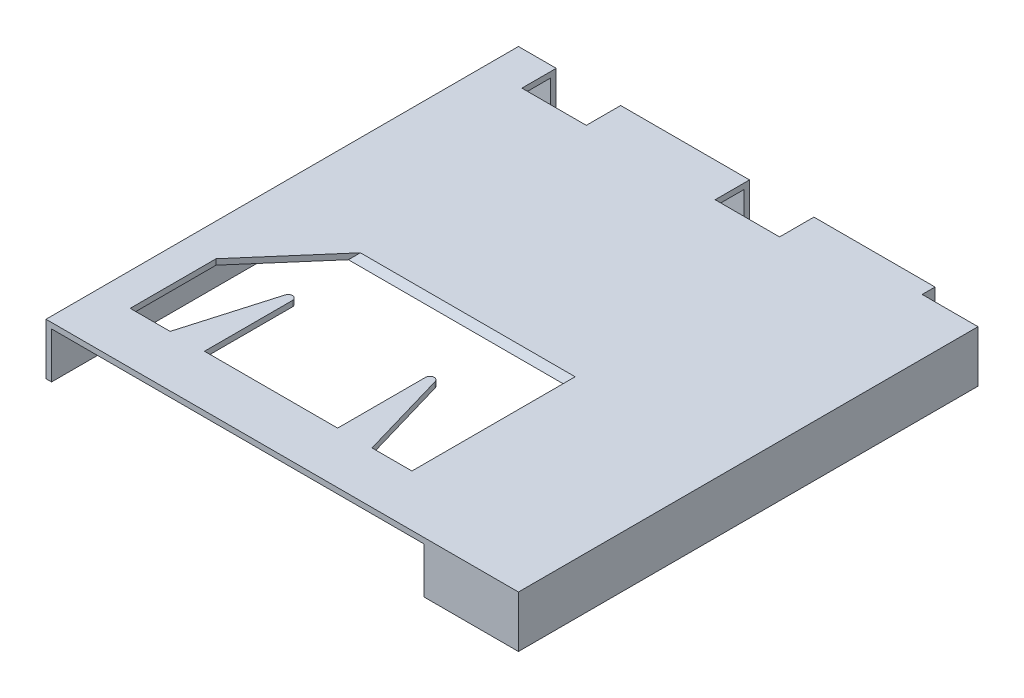
ISO-10303-21;
HEADER;
FILE_DESCRIPTION(('STEP AP214'),'2;1');
FILE_NAME('part.step','',(''),(''),'','','');
FILE_SCHEMA(('AUTOMOTIVE_DESIGN { 1 0 10303 214 1 1 1 1 }'));
ENDSEC;
DATA;
#1=APPLICATION_CONTEXT('core data for automotive mechanical design processes');
#2=APPLICATION_PROTOCOL_DEFINITION('international standard','automotive_design',2000,#1);
#3=PRODUCT_CONTEXT('',#1,'mechanical');
#4=PRODUCT('Part','Part','',(#3));
#5=PRODUCT_RELATED_PRODUCT_CATEGORY('part','',(#4));
#6=PRODUCT_DEFINITION_FORMATION('','',#4);
#7=PRODUCT_DEFINITION_CONTEXT('part definition',#1,'design');
#8=PRODUCT_DEFINITION('design','',#6,#7);
#9=PRODUCT_DEFINITION_SHAPE('','',#8);
#10=(LENGTH_UNIT() NAMED_UNIT(*) SI_UNIT(.MILLI.,.METRE.));
#11=(NAMED_UNIT(*) PLANE_ANGLE_UNIT() SI_UNIT($,.RADIAN.));
#12=(NAMED_UNIT(*) SI_UNIT($,.STERADIAN.) SOLID_ANGLE_UNIT());
#13=UNCERTAINTY_MEASURE_WITH_UNIT(LENGTH_MEASURE(1.E-05),#10,'distance_accuracy_value','');
#14=(GEOMETRIC_REPRESENTATION_CONTEXT(3) GLOBAL_UNCERTAINTY_ASSIGNED_CONTEXT((#13)) GLOBAL_UNIT_ASSIGNED_CONTEXT((#10,
#11,#12)) REPRESENTATION_CONTEXT('',''));
#15=CARTESIAN_POINT('',(0.,0.,0.));
#16=DIRECTION('',(0.,0.,1.));
#17=DIRECTION('',(1.,0.,0.));
#18=AXIS2_PLACEMENT_3D('',#15,#16,#17);
#19=CARTESIAN_POINT('',(-5.8674,1.3589,-5.969));
#20=DIRECTION('',(0.,-1.,0.));
#21=DIRECTION('',(0.,0.,-1.));
#22=AXIS2_PLACEMENT_3D('',#19,#20,#21);
#23=PLANE('',#22);
#24=DIRECTION('',(-1.,0.,0.));
#25=VECTOR('',#24,1.);
#26=CARTESIAN_POINT('',(-5.8674,1.3589,0.82549999999999));
#27=LINE('',#26,#25);
#28=CARTESIAN_POINT('',(2.3114,1.3589,0.82549999999999));
#29=VERTEX_POINT('',#28);
#30=CARTESIAN_POINT('',(-4.20369999999998,1.3589,0.82549999999999));
#31=VERTEX_POINT('',#30);
#32=EDGE_CURVE('E498',#29,#31,#27,.T.);
#33=ORIENTED_EDGE('',*,*,#32,.T.);
#34=DIRECTION('',(0.654930538417845,0.,-0.755689082789815));
#35=VECTOR('',#34,1.);
#36=CARTESIAN_POINT('',(-6.0198,1.3589,2.921));
#37=LINE('',#36,#35);
#38=CARTESIAN_POINT('',(-6.0198,1.3589,2.921));
#39=VERTEX_POINT('',#38);
#40=EDGE_CURVE('E496',#31,#39,#37,.F.);
#41=ORIENTED_EDGE('',*,*,#40,.T.);
#42=DIRECTION('',(0.,0.,-1.));
#43=VECTOR('',#42,1.);
#44=CARTESIAN_POINT('',(-6.0198,1.3589,-5.969));
#45=LINE('',#44,#43);
#46=CARTESIAN_POINT('',(-6.0198,1.3589,5.461));
#47=VERTEX_POINT('',#46);
#48=EDGE_CURVE('E340',#47,#39,#45,.T.);
#49=ORIENTED_EDGE('',*,*,#48,.F.);
#50=DIRECTION('',(-1.,0.,0.));
#51=VECTOR('',#50,1.);
#52=CARTESIAN_POINT('',(-5.8674,1.3589,5.461));
#53=LINE('',#52,#51);
#54=CARTESIAN_POINT('',(-4.8387,1.3589,5.461));
#55=VERTEX_POINT('',#54);
#56=EDGE_CURVE('E343',#55,#47,#53,.T.);
#57=ORIENTED_EDGE('',*,*,#56,.F.);
#58=DIRECTION('',(-0.279451293987715,0.,0.960159869130444));
#59=VECTOR('',#58,1.);
#60=CARTESIAN_POINT('',(-1.85216049436864,1.3589,-4.80037807401234));
#61=LINE('',#60,#59);
#62=CARTESIAN_POINT('',(-4.07164030337957,1.3589,2.825478341064));
#63=VERTEX_POINT('',#62);
#64=EDGE_CURVE('E345',#63,#55,#61,.T.);
#65=ORIENTED_EDGE('',*,*,#64,.F.);
#66=CARTESIAN_POINT('',(-3.9497,1.3589,2.86096865540044));
#67=DIRECTION('',(0.,-1.,0.));
#68=DIRECTION('',(0.,0.,-1.));
#69=AXIS2_PLACEMENT_3D('',#66,#67,#68);
#70=CIRCLE('',#69,0.127);
#71=CARTESIAN_POINT('',(-3.8227,1.3589,2.86096865540044));
#72=VERTEX_POINT('',#71);
#73=EDGE_CURVE('E347',#72,#63,#70,.F.);
#74=ORIENTED_EDGE('',*,*,#73,.F.);
#75=DIRECTION('',(0.,0.,-1.));
#76=VECTOR('',#75,1.);
#77=CARTESIAN_POINT('',(-3.8227,1.3589,-5.969));
#78=LINE('',#77,#76);
#79=CARTESIAN_POINT('',(-3.8227,1.3589,5.461));
#80=VERTEX_POINT('',#79);
#81=EDGE_CURVE('E312',#80,#72,#78,.T.);
#82=ORIENTED_EDGE('',*,*,#81,.F.);
#83=DIRECTION('',(-1.,0.,0.));
#84=VECTOR('',#83,1.);
#85=CARTESIAN_POINT('',(-5.8674,1.3589,5.461));
#86=LINE('',#85,#84);
#87=CARTESIAN_POINT('',(0.114299999999998,1.3589,5.461));
#88=VERTEX_POINT('',#87);
#89=EDGE_CURVE('E269',#88,#80,#86,.T.);
#90=ORIENTED_EDGE('',*,*,#89,.F.);
#91=DIRECTION('',(0.,0.,1.));
#92=VECTOR('',#91,1.);
#93=CARTESIAN_POINT('',(0.114299999999999,1.3589,-5.969));
#94=LINE('',#93,#92);
#95=CARTESIAN_POINT('',(0.114299999999998,1.3589,2.86096865540044));
#96=VERTEX_POINT('',#95);
#97=EDGE_CURVE('E330',#96,#88,#94,.T.);
#98=ORIENTED_EDGE('',*,*,#97,.F.);
#99=CARTESIAN_POINT('',(0.241299999999998,1.3589,2.86096865540044));
#100=DIRECTION('',(0.,-1.,0.));
#101=DIRECTION('',(0.,0.,-1.));
#102=AXIS2_PLACEMENT_3D('',#99,#100,#101);
#103=CIRCLE('',#102,0.127);
#104=CARTESIAN_POINT('',(0.363240303379565,1.3589,2.825478341064));
#105=VERTEX_POINT('',#104);
#106=EDGE_CURVE('E332',#105,#96,#103,.F.);
#107=ORIENTED_EDGE('',*,*,#106,.F.);
#108=DIRECTION('',(-0.279451293987715,0.,-0.960159869130444));
#109=VECTOR('',#108,1.);
#110=CARTESIAN_POINT('',(-2.48304536720141,1.3589,-6.95400500995256));
#111=LINE('',#110,#109);
#112=CARTESIAN_POINT('',(1.1303,1.3589,5.461));
#113=VERTEX_POINT('',#112);
#114=EDGE_CURVE('E334',#113,#105,#111,.T.);
#115=ORIENTED_EDGE('',*,*,#114,.F.);
#116=DIRECTION('',(-1.,0.,0.));
#117=VECTOR('',#116,1.);
#118=CARTESIAN_POINT('',(-5.8674,1.3589,5.461));
#119=LINE('',#118,#117);
#120=CARTESIAN_POINT('',(2.3114,1.3589,5.461));
#121=VERTEX_POINT('',#120);
#122=EDGE_CURVE('E336',#121,#113,#119,.T.);
#123=ORIENTED_EDGE('',*,*,#122,.F.);
#124=DIRECTION('',(0.,0.,1.));
#125=VECTOR('',#124,1.);
#126=CARTESIAN_POINT('',(2.3114,1.3589,-5.969));
#127=LINE('',#126,#125);
#128=EDGE_CURVE('E338',#29,#121,#127,.T.);
#129=ORIENTED_EDGE('',*,*,#128,.F.);
#130=EDGE_LOOP('',(#33,#41,#49,#57,#65,#74,#82,#90,#98,#107,#115,#123,#129));
#131=FACE_BOUND('',#130,.T.);
#132=DIRECTION('',(0.,0.,1.));
#133=VECTOR('',#132,1.);
#134=CARTESIAN_POINT('',(-3.9624,1.3589,-6.985));
#135=LINE('',#134,#133);
#136=CARTESIAN_POINT('',(-3.9624,1.3589,-6.8199));
#137=VERTEX_POINT('',#136);
#138=CARTESIAN_POINT('',(-3.9624,1.3589,-5.969));
#139=VERTEX_POINT('',#138);
#140=EDGE_CURVE('E442',#137,#139,#135,.T.);
#141=ORIENTED_EDGE('',*,*,#140,.F.);
#142=DIRECTION('',(-1.,0.,0.));
#143=VECTOR('',#142,1.);
#144=CARTESIAN_POINT('',(-3.9624,1.3589,-6.8199));
#145=LINE('',#144,#143);
#146=CARTESIAN_POINT('',(-0.152400000000002,1.3589,-6.8199));
#147=VERTEX_POINT('',#146);
#148=EDGE_CURVE('E406',#147,#137,#145,.T.);
#149=ORIENTED_EDGE('',*,*,#148,.F.);
#150=DIRECTION('',(0.,0.,1.));
#151=VECTOR('',#150,1.);
#152=CARTESIAN_POINT('',(-0.152400000000002,1.3589,-6.985));
#153=LINE('',#152,#151);
#154=CARTESIAN_POINT('',(-0.152400000000001,1.3589,-5.969));
#155=VERTEX_POINT('',#154);
#156=EDGE_CURVE('E432',#147,#155,#153,.T.);
#157=ORIENTED_EDGE('',*,*,#156,.T.);
#158=DIRECTION('',(1.,0.,0.));
#159=VECTOR('',#158,1.);
#160=CARTESIAN_POINT('',(-5.8674,1.3589,-5.969));
#161=LINE('',#160,#159);
#162=CARTESIAN_POINT('',(1.7526,1.3589,-5.969));
#163=VERTEX_POINT('',#162);
#164=EDGE_CURVE('E467',#155,#163,#161,.T.);
#165=ORIENTED_EDGE('',*,*,#164,.T.);
#166=DIRECTION('',(0.,0.,-1.));
#167=VECTOR('',#166,1.);
#168=CARTESIAN_POINT('',(1.7526,1.3589,6.985));
#169=LINE('',#168,#167);
#170=CARTESIAN_POINT('',(1.7526,1.3589,-6.8199));
#171=VERTEX_POINT('',#170);
#172=EDGE_CURVE('E371',#163,#171,#169,.T.);
#173=ORIENTED_EDGE('',*,*,#172,.T.);
#174=DIRECTION('',(-1.,0.,0.));
#175=VECTOR('',#174,1.);
#176=CARTESIAN_POINT('',(4.191,1.3589,-6.8199));
#177=LINE('',#176,#175);
#178=CARTESIAN_POINT('',(4.191,1.3589,-6.8199));
#179=VERTEX_POINT('',#178);
#180=EDGE_CURVE('E382',#179,#171,#177,.T.);
#181=ORIENTED_EDGE('',*,*,#180,.F.);
#182=DIRECTION('',(0.,0.,-1.));
#183=VECTOR('',#182,1.);
#184=CARTESIAN_POINT('',(4.191,1.3589,6.985));
#185=LINE('',#184,#183);
#186=CARTESIAN_POINT('',(4.191,1.3589,6.985));
#187=VERTEX_POINT('',#186);
#188=EDGE_CURVE('E376',#187,#179,#185,.T.);
#189=ORIENTED_EDGE('',*,*,#188,.F.);
#190=DIRECTION('',(1.,0.,0.));
#191=VECTOR('',#190,1.);
#192=CARTESIAN_POINT('',(-5.8674,1.3589,6.985));
#193=LINE('',#192,#191);
#194=CARTESIAN_POINT('',(-6.8199,1.3589,6.985));
#195=VERTEX_POINT('',#194);
#196=EDGE_CURVE('E462',#195,#187,#193,.T.);
#197=ORIENTED_EDGE('',*,*,#196,.F.);
#198=DIRECTION('',(0.,0.,1.));
#199=VECTOR('',#198,1.);
#200=CARTESIAN_POINT('',(-6.8199,1.3589,-6.8199));
#201=LINE('',#200,#199);
#202=CARTESIAN_POINT('',(-6.8199,1.3589,-6.8199));
#203=VERTEX_POINT('',#202);
#204=EDGE_CURVE('E391',#203,#195,#201,.T.);
#205=ORIENTED_EDGE('',*,*,#204,.F.);
#206=DIRECTION('',(1.,0.,0.));
#207=VECTOR('',#206,1.);
#208=CARTESIAN_POINT('',(-6.8199,1.3589,-6.8199));
#209=LINE('',#208,#207);
#210=CARTESIAN_POINT('',(-5.8674,1.3589,-6.8199));
#211=VERTEX_POINT('',#210);
#212=EDGE_CURVE('E400',#203,#211,#209,.T.);
#213=ORIENTED_EDGE('',*,*,#212,.T.);
#214=DIRECTION('',(0.,0.,1.));
#215=VECTOR('',#214,1.);
#216=CARTESIAN_POINT('',(-5.8674,1.3589,-6.8199));
#217=LINE('',#216,#215);
#218=CARTESIAN_POINT('',(-5.8674,1.3589,-5.969));
#219=VERTEX_POINT('',#218);
#220=EDGE_CURVE('E392',#211,#219,#217,.T.);
#221=ORIENTED_EDGE('',*,*,#220,.T.);
#222=EDGE_CURVE('E463',#219,#139,#161,.T.);
#223=ORIENTED_EDGE('',*,*,#222,.T.);
#224=EDGE_LOOP('',(#141,#149,#157,#165,#173,#181,#189,#197,#205,#213,#221,#223));
#225=FACE_BOUND('',#224,.T.);
#226=ADVANCED_FACE('F33',(#131,#225),#23,.T.);
#227=CARTESIAN_POINT('',(-5.8674,1.3589,-5.969));
#228=DIRECTION('',(0.,0.,-1.));
#229=DIRECTION('',(-1.,0.,0.));
#230=AXIS2_PLACEMENT_3D('',#227,#228,#229);
#231=PLANE('',#230);
#232=DIRECTION('',(-1.,0.,0.));
#233=VECTOR('',#232,1.);
#234=CARTESIAN_POINT('',(1.7526,1.524,-5.969));
#235=LINE('',#234,#233);
#236=CARTESIAN_POINT('',(-3.9624,1.524,-5.969));
#237=VERTEX_POINT('',#236);
#238=CARTESIAN_POINT('',(-5.8674,1.524,-5.969));
#239=VERTEX_POINT('',#238);
#240=EDGE_CURVE('E476',#237,#239,#235,.T.);
#241=ORIENTED_EDGE('',*,*,#240,.F.);
#242=DIRECTION('',(0.,1.,0.));
#243=VECTOR('',#242,1.);
#244=CARTESIAN_POINT('',(-3.9624,1.524,-5.969));
#245=LINE('',#244,#243);
#246=EDGE_CURVE('E424',#139,#237,#245,.T.);
#247=ORIENTED_EDGE('',*,*,#246,.F.);
#248=ORIENTED_EDGE('',*,*,#222,.F.);
#249=DIRECTION('',(0.,-1.,0.));
#250=VECTOR('',#249,1.);
#251=CARTESIAN_POINT('',(-5.8674,0.,-5.969));
#252=LINE('',#251,#250);
#253=EDGE_CURVE('E444',#239,#219,#252,.T.);
#254=ORIENTED_EDGE('',*,*,#253,.F.);
#255=EDGE_LOOP('',(#241,#247,#248,#254));
#256=FACE_BOUND('',#255,.T.);
#257=ADVANCED_FACE('F556',(#256),#231,.T.);
#258=ORIENTED_EDGE('',*,*,#164,.F.);
#259=DIRECTION('',(0.,-1.,0.));
#260=VECTOR('',#259,1.);
#261=CARTESIAN_POINT('',(-0.152400000000002,1.3589,-5.969));
#262=LINE('',#261,#260);
#263=CARTESIAN_POINT('',(-0.152400000000002,1.524,-5.969));
#264=VERTEX_POINT('',#263);
#265=EDGE_CURVE('E428',#264,#155,#262,.T.);
#266=ORIENTED_EDGE('',*,*,#265,.F.);
#267=CARTESIAN_POINT('',(1.7526,1.524,-5.969));
#268=VERTEX_POINT('',#267);
#269=EDGE_CURVE('E480',#268,#264,#235,.T.);
#270=ORIENTED_EDGE('',*,*,#269,.F.);
#271=DIRECTION('',(0.,1.,0.));
#272=VECTOR('',#271,1.);
#273=CARTESIAN_POINT('',(1.7526,1.3589,-5.969));
#274=LINE('',#273,#272);
#275=EDGE_CURVE('E466',#163,#268,#274,.T.);
#276=ORIENTED_EDGE('',*,*,#275,.F.);
#277=EDGE_LOOP('',(#258,#266,#270,#276));
#278=FACE_BOUND('',#277,.T.);
#279=ADVANCED_FACE('F561',(#278),#231,.T.);
#280=CARTESIAN_POINT('',(6.985,0.,-6.985));
#281=DIRECTION('',(0.,0.,-1.));
#282=DIRECTION('',(-1.,0.,0.));
#283=AXIS2_PLACEMENT_3D('',#280,#281,#282);
#284=PLANE('',#283);
#285=DIRECTION('',(0.,1.,0.));
#286=VECTOR('',#285,1.);
#287=CARTESIAN_POINT('',(5.334,0.,-6.985));
#288=LINE('',#287,#286);
#289=CARTESIAN_POINT('',(5.334,0.,-6.985));
#290=VERTEX_POINT('',#289);
#291=CARTESIAN_POINT('',(5.334,1.524,-6.985));
#292=VERTEX_POINT('',#291);
#293=EDGE_CURVE('E357',#290,#292,#288,.T.);
#294=ORIENTED_EDGE('',*,*,#293,.F.);
#295=DIRECTION('',(-1.,0.,0.));
#296=VECTOR('',#295,1.);
#297=CARTESIAN_POINT('',(6.985,0.,-6.985));
#298=LINE('',#297,#296);
#299=CARTESIAN_POINT('',(1.7526,0.,-6.985));
#300=VERTEX_POINT('',#299);
#301=EDGE_CURVE('E688',#290,#300,#298,.T.);
#302=ORIENTED_EDGE('',*,*,#301,.T.);
#303=DIRECTION('',(0.,1.,0.));
#304=VECTOR('',#303,1.);
#305=CARTESIAN_POINT('',(1.7526,0.,-6.985));
#306=LINE('',#305,#304);
#307=CARTESIAN_POINT('',(1.7526,1.524,-6.985));
#308=VERTEX_POINT('',#307);
#309=EDGE_CURVE('E699',#300,#308,#306,.T.);
#310=ORIENTED_EDGE('',*,*,#309,.T.);
#311=DIRECTION('',(-1.,0.,0.));
#312=VECTOR('',#311,1.);
#313=CARTESIAN_POINT('',(6.985,1.524,-6.985));
#314=LINE('',#313,#312);
#315=EDGE_CURVE('E683',#292,#308,#314,.T.);
#316=ORIENTED_EDGE('',*,*,#315,.F.);
#317=EDGE_LOOP('',(#294,#302,#310,#316));
#318=FACE_BOUND('',#317,.T.);
#319=ADVANCED_FACE('F584',(#318),#284,.T.);
#320=CARTESIAN_POINT('',(6.985,0.,6.985));
#321=DIRECTION('',(1.,0.,0.));
#322=DIRECTION('',(0.,0.,-1.));
#323=AXIS2_PLACEMENT_3D('',#320,#321,#322);
#324=PLANE('',#323);
#325=DIRECTION('',(0.,1.,0.));
#326=VECTOR('',#325,1.);
#327=CARTESIAN_POINT('',(6.985,0.,-6.604));
#328=LINE('',#327,#326);
#329=CARTESIAN_POINT('',(6.985,0.,-6.604));
#330=VERTEX_POINT('',#329);
#331=CARTESIAN_POINT('',(6.985,1.524,-6.604));
#332=VERTEX_POINT('',#331);
#333=EDGE_CURVE('E361',#330,#332,#328,.T.);
#334=ORIENTED_EDGE('',*,*,#333,.T.);
#335=DIRECTION('',(0.,0.,-1.));
#336=VECTOR('',#335,1.);
#337=CARTESIAN_POINT('',(6.985,1.524,6.985));
#338=LINE('',#337,#336);
#339=CARTESIAN_POINT('',(6.985,1.524,6.985));
#340=VERTEX_POINT('',#339);
#341=EDGE_CURVE('E691',#340,#332,#338,.T.);
#342=ORIENTED_EDGE('',*,*,#341,.F.);
#343=DIRECTION('',(0.,1.,0.));
#344=VECTOR('',#343,1.);
#345=CARTESIAN_POINT('',(6.985,0.,6.985));
#346=LINE('',#345,#344);
#347=CARTESIAN_POINT('',(6.985,0.,6.985));
#348=VERTEX_POINT('',#347);
#349=EDGE_CURVE('E494',#348,#340,#346,.T.);
#350=ORIENTED_EDGE('',*,*,#349,.F.);
#351=DIRECTION('',(0.,0.,-1.));
#352=VECTOR('',#351,1.);
#353=CARTESIAN_POINT('',(6.985,0.,6.985));
#354=LINE('',#353,#352);
#355=EDGE_CURVE('E696',#348,#330,#354,.T.);
#356=ORIENTED_EDGE('',*,*,#355,.T.);
#357=EDGE_LOOP('',(#334,#342,#350,#356));
#358=FACE_BOUND('',#357,.T.);
#359=ADVANCED_FACE('F580',(#358),#324,.T.);
#360=CARTESIAN_POINT('',(1.7526,0.,6.985));
#361=DIRECTION('',(0.,0.,1.));
#362=DIRECTION('',(1.,0.,0.));
#363=AXIS2_PLACEMENT_3D('',#360,#361,#362);
#364=PLANE('',#363);
#365=ORIENTED_EDGE('',*,*,#196,.T.);
#366=DIRECTION('',(0.,1.,0.));
#367=VECTOR('',#366,1.);
#368=CARTESIAN_POINT('',(4.191,0.,6.985));
#369=LINE('',#368,#367);
#370=CARTESIAN_POINT('',(4.191,0.,6.985));
#371=VERTEX_POINT('',#370);
#372=EDGE_CURVE('E373',#371,#187,#369,.T.);
#373=ORIENTED_EDGE('',*,*,#372,.F.);
#374=DIRECTION('',(1.,0.,0.));
#375=VECTOR('',#374,1.);
#376=CARTESIAN_POINT('',(1.7526,0.,6.985));
#377=LINE('',#376,#375);
#378=EDGE_CURVE('E694',#371,#348,#377,.T.);
#379=ORIENTED_EDGE('',*,*,#378,.T.);
#380=ORIENTED_EDGE('',*,*,#349,.T.);
#381=DIRECTION('',(1.,0.,0.));
#382=VECTOR('',#381,1.);
#383=CARTESIAN_POINT('',(1.7526,1.524,6.985));
#384=LINE('',#383,#382);
#385=CARTESIAN_POINT('',(-6.985,1.524,6.985));
#386=VERTEX_POINT('',#385);
#387=EDGE_CURVE('E702',#386,#340,#384,.T.);
#388=ORIENTED_EDGE('',*,*,#387,.F.);
#389=DIRECTION('',(0.,-1.,0.));
#390=VECTOR('',#389,1.);
#391=CARTESIAN_POINT('',(-6.985,1.524,6.985));
#392=LINE('',#391,#390);
#393=CARTESIAN_POINT('',(-6.985,0.,6.985));
#394=VERTEX_POINT('',#393);
#395=EDGE_CURVE('E470',#386,#394,#392,.T.);
#396=ORIENTED_EDGE('',*,*,#395,.T.);
#397=DIRECTION('',(1.,0.,0.));
#398=VECTOR('',#397,1.);
#399=CARTESIAN_POINT('',(-6.985,0.,6.985));
#400=LINE('',#399,#398);
#401=CARTESIAN_POINT('',(-6.8199,0.,6.985));
#402=VERTEX_POINT('',#401);
#403=EDGE_CURVE('E678',#394,#402,#400,.T.);
#404=ORIENTED_EDGE('',*,*,#403,.T.);
#405=DIRECTION('',(0.,-1.,0.));
#406=VECTOR('',#405,1.);
#407=CARTESIAN_POINT('',(-6.8199,1.3589,6.985));
#408=LINE('',#407,#406);
#409=EDGE_CURVE('E395',#195,#402,#408,.T.);
#410=ORIENTED_EDGE('',*,*,#409,.F.);
#411=EDGE_LOOP('',(#365,#373,#379,#380,#388,#396,#404,#410));
#412=FACE_BOUND('',#411,.T.);
#413=ADVANCED_FACE('F583',(#412),#364,.T.);
#414=CARTESIAN_POINT('',(1.7526,0.,-6.985));
#415=DIRECTION('',(-1.,0.,0.));
#416=DIRECTION('',(0.,0.,1.));
#417=AXIS2_PLACEMENT_3D('',#414,#415,#416);
#418=PLANE('',#417);
#419=DIRECTION('',(0.,-1.,0.));
#420=VECTOR('',#419,1.);
#421=CARTESIAN_POINT('',(1.7526,1.3589,-6.8199));
#422=LINE('',#421,#420);
#423=CARTESIAN_POINT('',(1.7526,0.,-6.8199));
#424=VERTEX_POINT('',#423);
#425=EDGE_CURVE('E364',#171,#424,#422,.T.);
#426=ORIENTED_EDGE('',*,*,#425,.F.);
#427=ORIENTED_EDGE('',*,*,#172,.F.);
#428=ORIENTED_EDGE('',*,*,#275,.T.);
#429=DIRECTION('',(0.,0.,1.));
#430=VECTOR('',#429,1.);
#431=CARTESIAN_POINT('',(1.7526,1.524,-6.985));
#432=LINE('',#431,#430);
#433=EDGE_CURVE('E477',#308,#268,#432,.T.);
#434=ORIENTED_EDGE('',*,*,#433,.F.);
#435=ORIENTED_EDGE('',*,*,#309,.F.);
#436=DIRECTION('',(0.,0.,1.));
#437=VECTOR('',#436,1.);
#438=CARTESIAN_POINT('',(1.7526,0.,-6.985));
#439=LINE('',#438,#437);
#440=EDGE_CURVE('E690',#300,#424,#439,.T.);
#441=ORIENTED_EDGE('',*,*,#440,.T.);
#442=EDGE_LOOP('',(#426,#427,#428,#434,#435,#441));
#443=FACE_BOUND('',#442,.T.);
#444=ADVANCED_FACE('F576',(#443),#418,.T.);
#445=CARTESIAN_POINT('',(1.7526,0.,-6.985));
#446=DIRECTION('',(0.,1.,0.));
#447=DIRECTION('',(0.,0.,1.));
#448=AXIS2_PLACEMENT_3D('',#445,#446,#447);
#449=PLANE('',#448);
#450=DIRECTION('',(0.,0.,1.));
#451=VECTOR('',#450,1.);
#452=CARTESIAN_POINT('',(5.334,0.,-6.985));
#453=LINE('',#452,#451);
#454=CARTESIAN_POINT('',(5.334,0.,-6.604));
#455=VERTEX_POINT('',#454);
#456=EDGE_CURVE('E350',#290,#455,#453,.T.);
#457=ORIENTED_EDGE('',*,*,#456,.T.);
#458=DIRECTION('',(1.,0.,0.));
#459=VECTOR('',#458,1.);
#460=CARTESIAN_POINT('',(5.334,0.,-6.604));
#461=LINE('',#460,#459);
#462=EDGE_CURVE('E353',#455,#330,#461,.T.);
#463=ORIENTED_EDGE('',*,*,#462,.T.);
#464=ORIENTED_EDGE('',*,*,#355,.F.);
#465=ORIENTED_EDGE('',*,*,#378,.F.);
#466=DIRECTION('',(0.,0.,1.));
#467=VECTOR('',#466,1.);
#468=CARTESIAN_POINT('',(4.191,0.,-6.8199));
#469=LINE('',#468,#467);
#470=CARTESIAN_POINT('',(4.191,0.,-6.8199));
#471=VERTEX_POINT('',#470);
#472=EDGE_CURVE('E370',#471,#371,#469,.T.);
#473=ORIENTED_EDGE('',*,*,#472,.F.);
#474=DIRECTION('',(-1.,0.,0.));
#475=VECTOR('',#474,1.);
#476=CARTESIAN_POINT('',(4.191,0.,-6.8199));
#477=LINE('',#476,#475);
#478=EDGE_CURVE('E379',#471,#424,#477,.T.);
#479=ORIENTED_EDGE('',*,*,#478,.T.);
#480=ORIENTED_EDGE('',*,*,#440,.F.);
#481=ORIENTED_EDGE('',*,*,#301,.F.);
#482=EDGE_LOOP('',(#457,#463,#464,#465,#473,#479,#480,#481));
#483=FACE_BOUND('',#482,.T.);
#484=ADVANCED_FACE('F573',(#483),#449,.F.);
#485=CARTESIAN_POINT('',(1.7526,1.524,-6.985));
#486=DIRECTION('',(0.,1.,0.));
#487=DIRECTION('',(0.,0.,1.));
#488=AXIS2_PLACEMENT_3D('',#485,#486,#487);
#489=PLANE('',#488);
#490=DIRECTION('',(-0.654930538417845,0.,0.755689082789815));
#491=VECTOR('',#490,1.);
#492=CARTESIAN_POINT('',(-6.0198,1.524,2.921));
#493=LINE('',#492,#491);
#494=CARTESIAN_POINT('',(-6.0198,1.524,2.921));
#495=VERTEX_POINT('',#494);
#496=CARTESIAN_POINT('',(-4.03859999999998,1.524,0.63499999999999));
#497=VERTEX_POINT('',#496);
#498=EDGE_CURVE('E48',#495,#497,#493,.F.);
#499=ORIENTED_EDGE('',*,*,#498,.T.);
#500=DIRECTION('',(1.,0.,0.));
#501=VECTOR('',#500,1.);
#502=CARTESIAN_POINT('',(2.3114,1.524,0.63499999999999));
#503=LINE('',#502,#501);
#504=CARTESIAN_POINT('',(2.3114,1.524,0.63499999999999));
#505=VERTEX_POINT('',#504);
#506=EDGE_CURVE('E501',#497,#505,#503,.T.);
#507=ORIENTED_EDGE('',*,*,#506,.T.);
#508=DIRECTION('',(0.,0.,-1.));
#509=VECTOR('',#508,1.);
#510=CARTESIAN_POINT('',(2.3114,1.524,5.461));
#511=LINE('',#510,#509);
#512=CARTESIAN_POINT('',(2.3114,1.524,5.461));
#513=VERTEX_POINT('',#512);
#514=EDGE_CURVE('E55',#513,#505,#511,.T.);
#515=ORIENTED_EDGE('',*,*,#514,.F.);
#516=DIRECTION('',(1.,0.,0.));
#517=VECTOR('',#516,1.);
#518=CARTESIAN_POINT('',(1.1303,1.524,5.461));
#519=LINE('',#518,#517);
#520=CARTESIAN_POINT('',(1.1303,1.524,5.461));
#521=VERTEX_POINT('',#520);
#522=EDGE_CURVE('E298',#521,#513,#519,.T.);
#523=ORIENTED_EDGE('',*,*,#522,.F.);
#524=DIRECTION('',(0.279451293987715,0.,0.960159869130444));
#525=VECTOR('',#524,1.);
#526=CARTESIAN_POINT('',(0.363240303379564,1.524,2.825478341064));
#527=LINE('',#526,#525);
#528=CARTESIAN_POINT('',(0.363240303379565,1.524,2.825478341064));
#529=VERTEX_POINT('',#528);
#530=EDGE_CURVE('E295',#529,#521,#527,.T.);
#531=ORIENTED_EDGE('',*,*,#530,.F.);
#532=CARTESIAN_POINT('',(0.241299999999998,1.524,2.86096865540044));
#533=DIRECTION('',(0.,-1.,0.));
#534=DIRECTION('',(0.,0.,-1.));
#535=AXIS2_PLACEMENT_3D('',#532,#533,#534);
#536=CIRCLE('',#535,0.127);
#537=CARTESIAN_POINT('',(0.114299999999998,1.524,2.86096865540044));
#538=VERTEX_POINT('',#537);
#539=EDGE_CURVE('E289',#538,#529,#536,.T.);
#540=ORIENTED_EDGE('',*,*,#539,.F.);
#541=DIRECTION('',(0.,0.,-1.));
#542=VECTOR('',#541,1.);
#543=CARTESIAN_POINT('',(0.114299999999998,1.524,5.461));
#544=LINE('',#543,#542);
#545=CARTESIAN_POINT('',(0.114299999999998,1.524,5.461));
#546=VERTEX_POINT('',#545);
#547=EDGE_CURVE('E287',#546,#538,#544,.T.);
#548=ORIENTED_EDGE('',*,*,#547,.F.);
#549=DIRECTION('',(1.,0.,0.));
#550=VECTOR('',#549,1.);
#551=CARTESIAN_POINT('',(-3.8227,1.524,5.461));
#552=LINE('',#551,#550);
#553=CARTESIAN_POINT('',(-3.8227,1.524,5.461));
#554=VERTEX_POINT('',#553);
#555=EDGE_CURVE('E266',#554,#546,#552,.T.);
#556=ORIENTED_EDGE('',*,*,#555,.F.);
#557=DIRECTION('',(0.,0.,1.));
#558=VECTOR('',#557,1.);
#559=CARTESIAN_POINT('',(-3.8227,1.524,2.86096865540044));
#560=LINE('',#559,#558);
#561=CARTESIAN_POINT('',(-3.8227,1.524,2.86096865540044));
#562=VERTEX_POINT('',#561);
#563=EDGE_CURVE('E277',#562,#554,#560,.T.);
#564=ORIENTED_EDGE('',*,*,#563,.F.);
#565=CARTESIAN_POINT('',(-3.9497,1.524,2.86096865540044));
#566=DIRECTION('',(0.,-1.,0.));
#567=DIRECTION('',(0.,0.,-1.));
#568=AXIS2_PLACEMENT_3D('',#565,#566,#567);
#569=CIRCLE('',#568,0.127);
#570=CARTESIAN_POINT('',(-4.07164030337957,1.524,2.825478341064));
#571=VERTEX_POINT('',#570);
#572=EDGE_CURVE('E281',#571,#562,#569,.T.);
#573=ORIENTED_EDGE('',*,*,#572,.F.);
#574=DIRECTION('',(0.279451293987715,0.,-0.960159869130444));
#575=VECTOR('',#574,1.);
#576=CARTESIAN_POINT('',(-4.8387,1.524,5.461));
#577=LINE('',#576,#575);
#578=CARTESIAN_POINT('',(-4.8387,1.524,5.461));
#579=VERTEX_POINT('',#578);
#580=EDGE_CURVE('E307',#579,#571,#577,.T.);
#581=ORIENTED_EDGE('',*,*,#580,.F.);
#582=DIRECTION('',(1.,0.,0.));
#583=VECTOR('',#582,1.);
#584=CARTESIAN_POINT('',(-6.0198,1.524,5.461));
#585=LINE('',#584,#583);
#586=CARTESIAN_POINT('',(-6.0198,1.524,5.461));
#587=VERTEX_POINT('',#586);
#588=EDGE_CURVE('E304',#587,#579,#585,.T.);
#589=ORIENTED_EDGE('',*,*,#588,.F.);
#590=DIRECTION('',(0.,0.,1.));
#591=VECTOR('',#590,1.);
#592=CARTESIAN_POINT('',(-6.0198,1.524,1.778));
#593=LINE('',#592,#591);
#594=EDGE_CURVE('E302',#495,#587,#593,.T.);
#595=ORIENTED_EDGE('',*,*,#594,.F.);
#596=EDGE_LOOP('',(#499,#507,#515,#523,#531,#540,#548,#556,#564,#573,#581,#589,#595));
#597=FACE_BOUND('',#596,.T.);
#598=DIRECTION('',(1.,0.,0.));
#599=VECTOR('',#598,1.);
#600=CARTESIAN_POINT('',(5.334,1.524,-6.604));
#601=LINE('',#600,#599);
#602=CARTESIAN_POINT('',(5.334,1.524,-6.604));
#603=VERTEX_POINT('',#602);
#604=EDGE_CURVE('E354',#603,#332,#601,.T.);
#605=ORIENTED_EDGE('',*,*,#604,.F.);
#606=DIRECTION('',(0.,0.,1.));
#607=VECTOR('',#606,1.);
#608=CARTESIAN_POINT('',(5.334,1.524,-6.985));
#609=LINE('',#608,#607);
#610=EDGE_CURVE('E349',#292,#603,#609,.T.);
#611=ORIENTED_EDGE('',*,*,#610,.F.);
#612=ORIENTED_EDGE('',*,*,#315,.T.);
#613=ORIENTED_EDGE('',*,*,#433,.T.);
#614=ORIENTED_EDGE('',*,*,#269,.T.);
#615=DIRECTION('',(0.,0.,1.));
#616=VECTOR('',#615,1.);
#617=CARTESIAN_POINT('',(-0.152400000000002,1.524,-6.985));
#618=LINE('',#617,#616);
#619=CARTESIAN_POINT('',(-0.152400000000002,1.524,-6.985));
#620=VERTEX_POINT('',#619);
#621=EDGE_CURVE('E437',#620,#264,#618,.T.);
#622=ORIENTED_EDGE('',*,*,#621,.F.);
#623=DIRECTION('',(1.,0.,0.));
#624=VECTOR('',#623,1.);
#625=CARTESIAN_POINT('',(-0.152400000000002,1.524,-6.985));
#626=LINE('',#625,#624);
#627=CARTESIAN_POINT('',(-3.9624,1.524,-6.985));
#628=VERTEX_POINT('',#627);
#629=EDGE_CURVE('E427',#628,#620,#626,.T.);
#630=ORIENTED_EDGE('',*,*,#629,.F.);
#631=DIRECTION('',(0.,0.,1.));
#632=VECTOR('',#631,1.);
#633=CARTESIAN_POINT('',(-3.9624,1.524,-6.985));
#634=LINE('',#633,#632);
#635=EDGE_CURVE('E439',#628,#237,#634,.T.);
#636=ORIENTED_EDGE('',*,*,#635,.T.);
#637=ORIENTED_EDGE('',*,*,#240,.T.);
#638=DIRECTION('',(0.,0.,1.));
#639=VECTOR('',#638,1.);
#640=CARTESIAN_POINT('',(-5.8674,1.524,-6.985));
#641=LINE('',#640,#639);
#642=CARTESIAN_POINT('',(-5.8674,1.524,-6.985));
#643=VERTEX_POINT('',#642);
#644=EDGE_CURVE('E457',#643,#239,#641,.T.);
#645=ORIENTED_EDGE('',*,*,#644,.F.);
#646=DIRECTION('',(1.,0.,0.));
#647=VECTOR('',#646,1.);
#648=CARTESIAN_POINT('',(-5.8674,1.524,-6.985));
#649=LINE('',#648,#647);
#650=CARTESIAN_POINT('',(-6.985,1.524,-6.985));
#651=VERTEX_POINT('',#650);
#652=EDGE_CURVE('E445',#651,#643,#649,.T.);
#653=ORIENTED_EDGE('',*,*,#652,.F.);
#654=DIRECTION('',(0.,0.,1.));
#655=VECTOR('',#654,1.);
#656=CARTESIAN_POINT('',(-6.985,1.524,-5.969));
#657=LINE('',#656,#655);
#658=EDGE_CURVE('E483',#651,#386,#657,.T.);
#659=ORIENTED_EDGE('',*,*,#658,.T.);
#660=ORIENTED_EDGE('',*,*,#387,.T.);
#661=ORIENTED_EDGE('',*,*,#341,.T.);
#662=EDGE_LOOP('',(#605,#611,#612,#613,#614,#622,#630,#636,#637,#645,#653,#659,#660,#661));
#663=FACE_BOUND('',#662,.T.);
#664=ADVANCED_FACE('F283',(#597,#663),#489,.T.);
#665=CARTESIAN_POINT('',(-5.8674,0.,-5.969));
#666=DIRECTION('',(1.,0.,0.));
#667=DIRECTION('',(0.,1.,0.));
#668=AXIS2_PLACEMENT_3D('',#665,#666,#667);
#669=PLANE('',#668);
#670=DIRECTION('',(0.,1.,0.));
#671=VECTOR('',#670,1.);
#672=CARTESIAN_POINT('',(-5.8674,0.,-6.8199));
#673=LINE('',#672,#671);
#674=CARTESIAN_POINT('',(-5.8674,0.,-6.8199));
#675=VERTEX_POINT('',#674);
#676=EDGE_CURVE('E385',#675,#211,#673,.T.);
#677=ORIENTED_EDGE('',*,*,#676,.F.);
#678=DIRECTION('',(0.,0.,1.));
#679=VECTOR('',#678,1.);
#680=CARTESIAN_POINT('',(-5.8674,0.,-5.969));
#681=LINE('',#680,#679);
#682=CARTESIAN_POINT('',(-5.8674,0.,-6.985));
#683=VERTEX_POINT('',#682);
#684=EDGE_CURVE('E667',#683,#675,#681,.T.);
#685=ORIENTED_EDGE('',*,*,#684,.F.);
#686=DIRECTION('',(0.,-1.,0.));
#687=VECTOR('',#686,1.);
#688=CARTESIAN_POINT('',(-5.8674,0.,-6.985));
#689=LINE('',#688,#687);
#690=EDGE_CURVE('E448',#643,#683,#689,.T.);
#691=ORIENTED_EDGE('',*,*,#690,.F.);
#692=ORIENTED_EDGE('',*,*,#644,.T.);
#693=ORIENTED_EDGE('',*,*,#253,.T.);
#694=ORIENTED_EDGE('',*,*,#220,.F.);
#695=EDGE_LOOP('',(#677,#685,#691,#692,#693,#694));
#696=FACE_BOUND('',#695,.T.);
#697=ADVANCED_FACE('F568',(#696),#669,.T.);
#698=CARTESIAN_POINT('',(-6.985,0.,-5.969));
#699=DIRECTION('',(0.,-1.,0.));
#700=DIRECTION('',(0.,0.,-1.));
#701=AXIS2_PLACEMENT_3D('',#698,#699,#700);
#702=PLANE('',#701);
#703=DIRECTION('',(1.,0.,0.));
#704=VECTOR('',#703,1.);
#705=CARTESIAN_POINT('',(-6.8199,0.,-6.8199));
#706=LINE('',#705,#704);
#707=CARTESIAN_POINT('',(-6.8199,0.,-6.8199));
#708=VERTEX_POINT('',#707);
#709=EDGE_CURVE('E404',#708,#675,#706,.T.);
#710=ORIENTED_EDGE('',*,*,#709,.F.);
#711=DIRECTION('',(0.,0.,-1.));
#712=VECTOR('',#711,1.);
#713=CARTESIAN_POINT('',(-6.8199,0.,6.985));
#714=LINE('',#713,#712);
#715=EDGE_CURVE('E397',#402,#708,#714,.T.);
#716=ORIENTED_EDGE('',*,*,#715,.F.);
#717=ORIENTED_EDGE('',*,*,#403,.F.);
#718=DIRECTION('',(0.,0.,1.));
#719=VECTOR('',#718,1.);
#720=CARTESIAN_POINT('',(-6.985,0.,-5.969));
#721=LINE('',#720,#719);
#722=CARTESIAN_POINT('',(-6.985,0.,-6.985));
#723=VERTEX_POINT('',#722);
#724=EDGE_CURVE('E684',#723,#394,#721,.T.);
#725=ORIENTED_EDGE('',*,*,#724,.F.);
#726=DIRECTION('',(-1.,0.,0.));
#727=VECTOR('',#726,1.);
#728=CARTESIAN_POINT('',(-6.985,0.,-6.985));
#729=LINE('',#728,#727);
#730=EDGE_CURVE('E451',#683,#723,#729,.T.);
#731=ORIENTED_EDGE('',*,*,#730,.F.);
#732=ORIENTED_EDGE('',*,*,#684,.T.);
#733=EDGE_LOOP('',(#710,#716,#717,#725,#731,#732));
#734=FACE_BOUND('',#733,.T.);
#735=ADVANCED_FACE('F571',(#734),#702,.T.);
#736=CARTESIAN_POINT('',(-6.985,1.524,-5.969));
#737=DIRECTION('',(-1.,0.,0.));
#738=DIRECTION('',(0.,0.,1.));
#739=AXIS2_PLACEMENT_3D('',#736,#737,#738);
#740=PLANE('',#739);
#741=ORIENTED_EDGE('',*,*,#395,.F.);
#742=ORIENTED_EDGE('',*,*,#658,.F.);
#743=DIRECTION('',(0.,1.,0.));
#744=VECTOR('',#743,1.);
#745=CARTESIAN_POINT('',(-6.985,1.524,-6.985));
#746=LINE('',#745,#744);
#747=EDGE_CURVE('E454',#723,#651,#746,.T.);
#748=ORIENTED_EDGE('',*,*,#747,.F.);
#749=ORIENTED_EDGE('',*,*,#724,.T.);
#750=EDGE_LOOP('',(#741,#742,#748,#749));
#751=FACE_BOUND('',#750,.T.);
#752=ADVANCED_FACE('F566',(#751),#740,.T.);
#753=CARTESIAN_POINT('',(-6.985,1.524,-6.985));
#754=DIRECTION('',(0.,0.,1.));
#755=DIRECTION('',(1.,0.,0.));
#756=AXIS2_PLACEMENT_3D('',#753,#754,#755);
#757=PLANE('',#756);
#758=ORIENTED_EDGE('',*,*,#652,.T.);
#759=ORIENTED_EDGE('',*,*,#690,.T.);
#760=ORIENTED_EDGE('',*,*,#730,.T.);
#761=ORIENTED_EDGE('',*,*,#747,.T.);
#762=EDGE_LOOP('',(#758,#759,#760,#761));
#763=FACE_BOUND('',#762,.T.);
#764=ADVANCED_FACE('F651',(#763),#757,.F.);
#765=CARTESIAN_POINT('',(-3.9624,1.524,-6.985));
#766=DIRECTION('',(1.,0.,0.));
#767=DIRECTION('',(0.,0.,-1.));
#768=AXIS2_PLACEMENT_3D('',#765,#766,#767);
#769=PLANE('',#768);
#770=ORIENTED_EDGE('',*,*,#246,.T.);
#771=ORIENTED_EDGE('',*,*,#635,.F.);
#772=DIRECTION('',(0.,1.,0.));
#773=VECTOR('',#772,1.);
#774=CARTESIAN_POINT('',(-3.9624,1.524,-6.985));
#775=LINE('',#774,#773);
#776=CARTESIAN_POINT('',(-3.9624,0.,-6.985));
#777=VERTEX_POINT('',#776);
#778=EDGE_CURVE('E425',#777,#628,#775,.T.);
#779=ORIENTED_EDGE('',*,*,#778,.F.);
#780=DIRECTION('',(0.,0.,-1.));
#781=VECTOR('',#780,1.);
#782=CARTESIAN_POINT('',(-3.9624,0.,-6.985));
#783=LINE('',#782,#781);
#784=CARTESIAN_POINT('',(-3.9624,0.,-6.8199));
#785=VERTEX_POINT('',#784);
#786=EDGE_CURVE('E415',#785,#777,#783,.T.);
#787=ORIENTED_EDGE('',*,*,#786,.F.);
#788=DIRECTION('',(0.,1.,0.));
#789=VECTOR('',#788,1.);
#790=CARTESIAN_POINT('',(-3.9624,0.,-6.8199));
#791=LINE('',#790,#789);
#792=EDGE_CURVE('E418',#785,#137,#791,.T.);
#793=ORIENTED_EDGE('',*,*,#792,.T.);
#794=ORIENTED_EDGE('',*,*,#140,.T.);
#795=EDGE_LOOP('',(#770,#771,#779,#787,#793,#794));
#796=FACE_BOUND('',#795,.T.);
#797=ADVANCED_FACE('F647',(#796),#769,.F.);
#798=CARTESIAN_POINT('',(-0.152400000000002,1.3589,-6.985));
#799=DIRECTION('',(-1.,0.,0.));
#800=DIRECTION('',(0.,0.,1.));
#801=AXIS2_PLACEMENT_3D('',#798,#799,#800);
#802=PLANE('',#801);
#803=ORIENTED_EDGE('',*,*,#265,.T.);
#804=ORIENTED_EDGE('',*,*,#156,.F.);
#805=DIRECTION('',(0.,1.,0.));
#806=VECTOR('',#805,1.);
#807=CARTESIAN_POINT('',(-0.152400000000002,0.,-6.8199));
#808=LINE('',#807,#806);
#809=CARTESIAN_POINT('',(-0.152400000000002,0.,-6.8199));
#810=VERTEX_POINT('',#809);
#811=EDGE_CURVE('E422',#810,#147,#808,.T.);
#812=ORIENTED_EDGE('',*,*,#811,.F.);
#813=DIRECTION('',(0.,0.,1.));
#814=VECTOR('',#813,1.);
#815=CARTESIAN_POINT('',(-0.152400000000002,0.,-6.8199));
#816=LINE('',#815,#814);
#817=CARTESIAN_POINT('',(-0.152400000000002,0.,-6.985));
#818=VERTEX_POINT('',#817);
#819=EDGE_CURVE('E411',#818,#810,#816,.T.);
#820=ORIENTED_EDGE('',*,*,#819,.F.);
#821=DIRECTION('',(0.,-1.,0.));
#822=VECTOR('',#821,1.);
#823=CARTESIAN_POINT('',(-0.152400000000002,1.3589,-6.985));
#824=LINE('',#823,#822);
#825=EDGE_CURVE('E430',#620,#818,#824,.T.);
#826=ORIENTED_EDGE('',*,*,#825,.F.);
#827=ORIENTED_EDGE('',*,*,#621,.T.);
#828=EDGE_LOOP('',(#803,#804,#812,#820,#826,#827));
#829=FACE_BOUND('',#828,.T.);
#830=ADVANCED_FACE('F643',(#829),#802,.F.);
#831=CARTESIAN_POINT('',(-0.152400000000002,1.3589,-6.985));
#832=DIRECTION('',(0.,0.,1.));
#833=DIRECTION('',(1.,0.,0.));
#834=AXIS2_PLACEMENT_3D('',#831,#832,#833);
#835=PLANE('',#834);
#836=ORIENTED_EDGE('',*,*,#825,.T.);
#837=DIRECTION('',(1.,0.,0.));
#838=VECTOR('',#837,1.);
#839=CARTESIAN_POINT('',(-0.152400000000002,0.,-6.985));
#840=LINE('',#839,#838);
#841=EDGE_CURVE('E408',#777,#818,#840,.T.);
#842=ORIENTED_EDGE('',*,*,#841,.F.);
#843=ORIENTED_EDGE('',*,*,#778,.T.);
#844=ORIENTED_EDGE('',*,*,#629,.T.);
#845=EDGE_LOOP('',(#836,#842,#843,#844));
#846=FACE_BOUND('',#845,.T.);
#847=ADVANCED_FACE('F639',(#846),#835,.F.);
#848=CARTESIAN_POINT('',(-3.9624,0.,-6.8199));
#849=DIRECTION('',(0.,0.,-1.));
#850=DIRECTION('',(-1.,0.,0.));
#851=AXIS2_PLACEMENT_3D('',#848,#849,#850);
#852=PLANE('',#851);
#853=ORIENTED_EDGE('',*,*,#148,.T.);
#854=ORIENTED_EDGE('',*,*,#792,.F.);
#855=DIRECTION('',(-1.,0.,0.));
#856=VECTOR('',#855,1.);
#857=CARTESIAN_POINT('',(-3.9624,0.,-6.8199));
#858=LINE('',#857,#856);
#859=EDGE_CURVE('E413',#810,#785,#858,.T.);
#860=ORIENTED_EDGE('',*,*,#859,.F.);
#861=ORIENTED_EDGE('',*,*,#811,.T.);
#862=EDGE_LOOP('',(#853,#854,#860,#861));
#863=FACE_BOUND('',#862,.T.);
#864=ADVANCED_FACE('F635',(#863),#852,.F.);
#865=CARTESIAN_POINT('',(-3.9624,0.,-6.985));
#866=DIRECTION('',(0.,1.,0.));
#867=DIRECTION('',(0.,0.,1.));
#868=AXIS2_PLACEMENT_3D('',#865,#866,#867);
#869=PLANE('',#868);
#870=ORIENTED_EDGE('',*,*,#841,.T.);
#871=ORIENTED_EDGE('',*,*,#819,.T.);
#872=ORIENTED_EDGE('',*,*,#859,.T.);
#873=ORIENTED_EDGE('',*,*,#786,.T.);
#874=EDGE_LOOP('',(#870,#871,#872,#873));
#875=FACE_BOUND('',#874,.T.);
#876=ADVANCED_FACE('F631',(#875),#869,.F.);
#877=CARTESIAN_POINT('',(-6.8199,0.,-6.8199));
#878=DIRECTION('',(0.,0.,-1.));
#879=DIRECTION('',(-1.,0.,0.));
#880=AXIS2_PLACEMENT_3D('',#877,#878,#879);
#881=PLANE('',#880);
#882=ORIENTED_EDGE('',*,*,#676,.T.);
#883=ORIENTED_EDGE('',*,*,#212,.F.);
#884=DIRECTION('',(0.,1.,0.));
#885=VECTOR('',#884,1.);
#886=CARTESIAN_POINT('',(-6.8199,0.,-6.8199));
#887=LINE('',#886,#885);
#888=EDGE_CURVE('E388',#708,#203,#887,.T.);
#889=ORIENTED_EDGE('',*,*,#888,.F.);
#890=ORIENTED_EDGE('',*,*,#709,.T.);
#891=EDGE_LOOP('',(#882,#883,#889,#890));
#892=FACE_BOUND('',#891,.T.);
#893=ADVANCED_FACE('F627',(#892),#881,.F.);
#894=CARTESIAN_POINT('',(-6.8199,1.3589,-6.8199));
#895=DIRECTION('',(1.,0.,0.));
#896=DIRECTION('',(0.,1.,0.));
#897=AXIS2_PLACEMENT_3D('',#894,#895,#896);
#898=PLANE('',#897);
#899=ORIENTED_EDGE('',*,*,#888,.T.);
#900=ORIENTED_EDGE('',*,*,#204,.T.);
#901=ORIENTED_EDGE('',*,*,#409,.T.);
#902=ORIENTED_EDGE('',*,*,#715,.T.);
#903=EDGE_LOOP('',(#899,#900,#901,#902));
#904=FACE_BOUND('',#903,.T.);
#905=ADVANCED_FACE('F623',(#904),#898,.T.);
#906=CARTESIAN_POINT('',(4.191,1.3589,-6.8199));
#907=DIRECTION('',(0.,0.,-1.));
#908=DIRECTION('',(-1.,0.,0.));
#909=AXIS2_PLACEMENT_3D('',#906,#907,#908);
#910=PLANE('',#909);
#911=ORIENTED_EDGE('',*,*,#425,.T.);
#912=ORIENTED_EDGE('',*,*,#478,.F.);
#913=DIRECTION('',(0.,-1.,0.));
#914=VECTOR('',#913,1.);
#915=CARTESIAN_POINT('',(4.191,1.3589,-6.8199));
#916=LINE('',#915,#914);
#917=EDGE_CURVE('E368',#179,#471,#916,.T.);
#918=ORIENTED_EDGE('',*,*,#917,.F.);
#919=ORIENTED_EDGE('',*,*,#180,.T.);
#920=EDGE_LOOP('',(#911,#912,#918,#919));
#921=FACE_BOUND('',#920,.T.);
#922=ADVANCED_FACE('F619',(#921),#910,.F.);
#923=CARTESIAN_POINT('',(4.191,0.,-6.8199));
#924=DIRECTION('',(-1.,0.,0.));
#925=DIRECTION('',(0.,0.,1.));
#926=AXIS2_PLACEMENT_3D('',#923,#924,#925);
#927=PLANE('',#926);
#928=ORIENTED_EDGE('',*,*,#917,.T.);
#929=ORIENTED_EDGE('',*,*,#472,.T.);
#930=ORIENTED_EDGE('',*,*,#372,.T.);
#931=ORIENTED_EDGE('',*,*,#188,.T.);
#932=EDGE_LOOP('',(#928,#929,#930,#931));
#933=FACE_BOUND('',#932,.T.);
#934=ADVANCED_FACE('F612',(#933),#927,.T.);
#935=CARTESIAN_POINT('',(5.334,0.,-6.604));
#936=DIRECTION('',(0.,0.,1.));
#937=DIRECTION('',(1.,0.,0.));
#938=AXIS2_PLACEMENT_3D('',#935,#936,#937);
#939=PLANE('',#938);
#940=ORIENTED_EDGE('',*,*,#604,.T.);
#941=ORIENTED_EDGE('',*,*,#333,.F.);
#942=ORIENTED_EDGE('',*,*,#462,.F.);
#943=DIRECTION('',(0.,1.,0.));
#944=VECTOR('',#943,1.);
#945=CARTESIAN_POINT('',(5.334,0.,-6.604));
#946=LINE('',#945,#944);
#947=EDGE_CURVE('E365',#455,#603,#946,.T.);
#948=ORIENTED_EDGE('',*,*,#947,.T.);
#949=EDGE_LOOP('',(#940,#941,#942,#948));
#950=FACE_BOUND('',#949,.T.);
#951=ADVANCED_FACE('F609',(#950),#939,.F.);
#952=CARTESIAN_POINT('',(5.334,0.,-6.985));
#953=DIRECTION('',(-1.,0.,0.));
#954=DIRECTION('',(0.,0.,1.));
#955=AXIS2_PLACEMENT_3D('',#952,#953,#954);
#956=PLANE('',#955);
#957=ORIENTED_EDGE('',*,*,#610,.T.);
#958=ORIENTED_EDGE('',*,*,#947,.F.);
#959=ORIENTED_EDGE('',*,*,#456,.F.);
#960=ORIENTED_EDGE('',*,*,#293,.T.);
#961=EDGE_LOOP('',(#957,#958,#959,#960));
#962=FACE_BOUND('',#961,.T.);
#963=ADVANCED_FACE('F608',(#962),#956,.F.);
#964=CARTESIAN_POINT('',(-3.9497,0.,2.86096865540044));
#965=DIRECTION('',(0.,1.,0.));
#966=DIRECTION('',(0.,0.,1.));
#967=AXIS2_PLACEMENT_3D('',#964,#965,#966);
#968=CYLINDRICAL_SURFACE('',#967,0.127);
#969=ORIENTED_EDGE('',*,*,#73,.T.);
#970=DIRECTION('',(0.,1.,0.));
#971=VECTOR('',#970,1.);
#972=CARTESIAN_POINT('',(-4.07164030337957,0.,2.825478341064));
#973=LINE('',#972,#971);
#974=EDGE_CURVE('E310',#63,#571,#973,.T.);
#975=ORIENTED_EDGE('',*,*,#974,.T.);
#976=ORIENTED_EDGE('',*,*,#572,.T.);
#977=DIRECTION('',(0.,1.,0.));
#978=VECTOR('',#977,1.);
#979=CARTESIAN_POINT('',(-3.8227,0.,2.86096865540044));
#980=LINE('',#979,#978);
#981=EDGE_CURVE('E273',#72,#562,#980,.T.);
#982=ORIENTED_EDGE('',*,*,#981,.F.);
#983=EDGE_LOOP('',(#969,#975,#976,#982));
#984=FACE_BOUND('',#983,.T.);
#985=ADVANCED_FACE('F532',(#984),#968,.T.);
#986=CARTESIAN_POINT('',(-4.8387,0.,5.461));
#987=DIRECTION('',(0.960159869130444,0.,0.279451293987715));
#988=DIRECTION('',(0.279451293987715,0.,-0.960159869130444));
#989=AXIS2_PLACEMENT_3D('',#986,#987,#988);
#990=PLANE('',#989);
#991=ORIENTED_EDGE('',*,*,#64,.T.);
#992=DIRECTION('',(0.,1.,0.));
#993=VECTOR('',#992,1.);
#994=CARTESIAN_POINT('',(-4.8387,0.,5.461));
#995=LINE('',#994,#993);
#996=EDGE_CURVE('E313',#55,#579,#995,.T.);
#997=ORIENTED_EDGE('',*,*,#996,.T.);
#998=ORIENTED_EDGE('',*,*,#580,.T.);
#999=ORIENTED_EDGE('',*,*,#974,.F.);
#1000=EDGE_LOOP('',(#991,#997,#998,#999));
#1001=FACE_BOUND('',#1000,.T.);
#1002=ADVANCED_FACE('F537',(#1001),#990,.F.);
#1003=CARTESIAN_POINT('',(-6.0198,0.,5.461));
#1004=DIRECTION('',(0.,0.,1.));
#1005=DIRECTION('',(1.,0.,0.));
#1006=AXIS2_PLACEMENT_3D('',#1003,#1004,#1005);
#1007=PLANE('',#1006);
#1008=ORIENTED_EDGE('',*,*,#56,.T.);
#1009=DIRECTION('',(0.,1.,0.));
#1010=VECTOR('',#1009,1.);
#1011=CARTESIAN_POINT('',(-6.0198,0.,5.461));
#1012=LINE('',#1011,#1010);
#1013=EDGE_CURVE('E315',#47,#587,#1012,.T.);
#1014=ORIENTED_EDGE('',*,*,#1013,.T.);
#1015=ORIENTED_EDGE('',*,*,#588,.T.);
#1016=ORIENTED_EDGE('',*,*,#996,.F.);
#1017=EDGE_LOOP('',(#1008,#1014,#1015,#1016));
#1018=FACE_BOUND('',#1017,.T.);
#1019=ADVANCED_FACE('F541',(#1018),#1007,.F.);
#1020=CARTESIAN_POINT('',(-6.0198,0.,1.778));
#1021=DIRECTION('',(-1.,0.,0.));
#1022=DIRECTION('',(0.,0.,1.));
#1023=AXIS2_PLACEMENT_3D('',#1020,#1021,#1022);
#1024=PLANE('',#1023);
#1025=ORIENTED_EDGE('',*,*,#48,.T.);
#1026=DIRECTION('',(0.,1.,0.));
#1027=VECTOR('',#1026,1.);
#1028=CARTESIAN_POINT('',(-6.0198,1.524,2.921));
#1029=LINE('',#1028,#1027);
#1030=EDGE_CURVE('E491',#39,#495,#1029,.T.);
#1031=ORIENTED_EDGE('',*,*,#1030,.T.);
#1032=ORIENTED_EDGE('',*,*,#594,.T.);
#1033=ORIENTED_EDGE('',*,*,#1013,.F.);
#1034=EDGE_LOOP('',(#1025,#1031,#1032,#1033));
#1035=FACE_BOUND('',#1034,.T.);
#1036=ADVANCED_FACE('F545',(#1035),#1024,.F.);
#1037=CARTESIAN_POINT('',(2.3114,0.,5.461));
#1038=DIRECTION('',(1.,0.,0.));
#1039=DIRECTION('',(0.,0.,-1.));
#1040=AXIS2_PLACEMENT_3D('',#1037,#1038,#1039);
#1041=PLANE('',#1040);
#1042=ORIENTED_EDGE('',*,*,#128,.T.);
#1043=DIRECTION('',(0.,1.,0.));
#1044=VECTOR('',#1043,1.);
#1045=CARTESIAN_POINT('',(2.3114,0.,5.461));
#1046=LINE('',#1045,#1044);
#1047=EDGE_CURVE('E318',#121,#513,#1046,.T.);
#1048=ORIENTED_EDGE('',*,*,#1047,.T.);
#1049=ORIENTED_EDGE('',*,*,#514,.T.);
#1050=DIRECTION('',(0.,-0.654930538417841,0.755689082789819));
#1051=VECTOR('',#1050,1.);
#1052=CARTESIAN_POINT('',(2.3114,-1.51819796954315,4.14522842639594));
#1053=LINE('',#1052,#1051);
#1054=EDGE_CURVE('E11',#505,#29,#1053,.T.);
#1055=ORIENTED_EDGE('',*,*,#1054,.T.);
#1056=EDGE_LOOP('',(#1042,#1048,#1049,#1055));
#1057=FACE_BOUND('',#1056,.T.);
#1058=ADVANCED_FACE('F546',(#1057),#1041,.F.);
#1059=CARTESIAN_POINT('',(1.1303,0.,5.461));
#1060=DIRECTION('',(0.,0.,1.));
#1061=DIRECTION('',(1.,0.,0.));
#1062=AXIS2_PLACEMENT_3D('',#1059,#1060,#1061);
#1063=PLANE('',#1062);
#1064=ORIENTED_EDGE('',*,*,#122,.T.);
#1065=DIRECTION('',(0.,1.,0.));
#1066=VECTOR('',#1065,1.);
#1067=CARTESIAN_POINT('',(1.1303,0.,5.461));
#1068=LINE('',#1067,#1066);
#1069=EDGE_CURVE('E320',#113,#521,#1068,.T.);
#1070=ORIENTED_EDGE('',*,*,#1069,.T.);
#1071=ORIENTED_EDGE('',*,*,#522,.T.);
#1072=ORIENTED_EDGE('',*,*,#1047,.F.);
#1073=EDGE_LOOP('',(#1064,#1070,#1071,#1072));
#1074=FACE_BOUND('',#1073,.T.);
#1075=ADVANCED_FACE('F513',(#1074),#1063,.F.);
#1076=CARTESIAN_POINT('',(0.363240303379564,0.,2.825478341064));
#1077=DIRECTION('',(-0.960159869130444,0.,0.279451293987715));
#1078=DIRECTION('',(0.279451293987715,0.,0.960159869130444));
#1079=AXIS2_PLACEMENT_3D('',#1076,#1077,#1078);
#1080=PLANE('',#1079);
#1081=ORIENTED_EDGE('',*,*,#114,.T.);
#1082=DIRECTION('',(0.,1.,0.));
#1083=VECTOR('',#1082,1.);
#1084=CARTESIAN_POINT('',(0.363240303379565,0.,2.825478341064));
#1085=LINE('',#1084,#1083);
#1086=EDGE_CURVE('E322',#105,#529,#1085,.T.);
#1087=ORIENTED_EDGE('',*,*,#1086,.T.);
#1088=ORIENTED_EDGE('',*,*,#530,.T.);
#1089=ORIENTED_EDGE('',*,*,#1069,.F.);
#1090=EDGE_LOOP('',(#1081,#1087,#1088,#1089));
#1091=FACE_BOUND('',#1090,.T.);
#1092=ADVANCED_FACE('F518',(#1091),#1080,.F.);
#1093=CARTESIAN_POINT('',(0.241299999999998,0.,2.86096865540044));
#1094=DIRECTION('',(0.,1.,0.));
#1095=DIRECTION('',(0.,0.,1.));
#1096=AXIS2_PLACEMENT_3D('',#1093,#1094,#1095);
#1097=CYLINDRICAL_SURFACE('',#1096,0.127);
#1098=ORIENTED_EDGE('',*,*,#106,.T.);
#1099=DIRECTION('',(0.,1.,0.));
#1100=VECTOR('',#1099,1.);
#1101=CARTESIAN_POINT('',(0.114299999999998,0.,2.86096865540044));
#1102=LINE('',#1101,#1100);
#1103=EDGE_CURVE('E324',#96,#538,#1102,.T.);
#1104=ORIENTED_EDGE('',*,*,#1103,.T.);
#1105=ORIENTED_EDGE('',*,*,#539,.T.);
#1106=ORIENTED_EDGE('',*,*,#1086,.F.);
#1107=EDGE_LOOP('',(#1098,#1104,#1105,#1106));
#1108=FACE_BOUND('',#1107,.T.);
#1109=ADVANCED_FACE('F522',(#1108),#1097,.T.);
#1110=CARTESIAN_POINT('',(0.114299999999998,0.,5.461));
#1111=DIRECTION('',(1.,0.,0.));
#1112=DIRECTION('',(0.,0.,-1.));
#1113=AXIS2_PLACEMENT_3D('',#1110,#1111,#1112);
#1114=PLANE('',#1113);
#1115=ORIENTED_EDGE('',*,*,#97,.T.);
#1116=DIRECTION('',(0.,1.,0.));
#1117=VECTOR('',#1116,1.);
#1118=CARTESIAN_POINT('',(0.114299999999998,0.,5.461));
#1119=LINE('',#1118,#1117);
#1120=EDGE_CURVE('E272',#88,#546,#1119,.T.);
#1121=ORIENTED_EDGE('',*,*,#1120,.T.);
#1122=ORIENTED_EDGE('',*,*,#547,.T.);
#1123=ORIENTED_EDGE('',*,*,#1103,.F.);
#1124=EDGE_LOOP('',(#1115,#1121,#1122,#1123));
#1125=FACE_BOUND('',#1124,.T.);
#1126=ADVANCED_FACE('F526',(#1125),#1114,.F.);
#1127=CARTESIAN_POINT('',(-3.8227,0.,5.461));
#1128=DIRECTION('',(0.,0.,1.));
#1129=DIRECTION('',(1.,0.,0.));
#1130=AXIS2_PLACEMENT_3D('',#1127,#1128,#1129);
#1131=PLANE('',#1130);
#1132=ORIENTED_EDGE('',*,*,#89,.T.);
#1133=DIRECTION('',(0.,1.,0.));
#1134=VECTOR('',#1133,1.);
#1135=CARTESIAN_POINT('',(-3.8227,0.,5.461));
#1136=LINE('',#1135,#1134);
#1137=EDGE_CURVE('E261',#80,#554,#1136,.T.);
#1138=ORIENTED_EDGE('',*,*,#1137,.T.);
#1139=ORIENTED_EDGE('',*,*,#555,.T.);
#1140=ORIENTED_EDGE('',*,*,#1120,.F.);
#1141=EDGE_LOOP('',(#1132,#1138,#1139,#1140));
#1142=FACE_BOUND('',#1141,.T.);
#1143=ADVANCED_FACE('F263',(#1142),#1131,.F.);
#1144=CARTESIAN_POINT('',(-3.8227,0.,2.86096865540044));
#1145=DIRECTION('',(-1.,0.,0.));
#1146=DIRECTION('',(0.,0.,1.));
#1147=AXIS2_PLACEMENT_3D('',#1144,#1145,#1146);
#1148=PLANE('',#1147);
#1149=ORIENTED_EDGE('',*,*,#81,.T.);
#1150=ORIENTED_EDGE('',*,*,#981,.T.);
#1151=ORIENTED_EDGE('',*,*,#563,.T.);
#1152=ORIENTED_EDGE('',*,*,#1137,.F.);
#1153=EDGE_LOOP('',(#1149,#1150,#1151,#1152));
#1154=FACE_BOUND('',#1153,.T.);
#1155=ADVANCED_FACE('F278',(#1154),#1148,.F.);
#1156=CARTESIAN_POINT('',(-6.0198,0.,2.921));
#1157=DIRECTION('',(0.755689082789815,0.,0.654930538417845));
#1158=DIRECTION('',(0.654930538417845,0.,-0.755689082789815));
#1159=AXIS2_PLACEMENT_3D('',#1156,#1157,#1158);
#1160=PLANE('',#1159);
#1161=ORIENTED_EDGE('',*,*,#40,.F.);
#1162=DIRECTION('',(-0.54788467754942,-0.547884677549414,0.632174627941633));
#1163=VECTOR('',#1162,1.);
#1164=CARTESIAN_POINT('',(-5.88255879218472,-0.319958792184728,2.76264476021314));
#1165=LINE('',#1164,#1163);
#1166=EDGE_CURVE('E41',#31,#497,#1165,.F.);
#1167=ORIENTED_EDGE('',*,*,#1166,.T.);
#1168=ORIENTED_EDGE('',*,*,#498,.F.);
#1169=ORIENTED_EDGE('',*,*,#1030,.F.);
#1170=EDGE_LOOP('',(#1161,#1167,#1168,#1169));
#1171=FACE_BOUND('',#1170,.T.);
#1172=ADVANCED_FACE('F505',(#1171),#1160,.T.);
#1173=CARTESIAN_POINT('',(2.3114,0.53339999999999,1.778));
#1174=DIRECTION('',(0.,0.755689082789819,0.654930538417841));
#1175=DIRECTION('',(0.,-0.654930538417841,0.755689082789819));
#1176=AXIS2_PLACEMENT_3D('',#1173,#1174,#1175);
#1177=PLANE('',#1176);
#1178=ORIENTED_EDGE('',*,*,#1054,.F.);
#1179=ORIENTED_EDGE('',*,*,#506,.F.);
#1180=ORIENTED_EDGE('',*,*,#1166,.F.);
#1181=ORIENTED_EDGE('',*,*,#32,.F.);
#1182=EDGE_LOOP('',(#1178,#1179,#1180,#1181));
#1183=FACE_BOUND('',#1182,.T.);
#1184=ADVANCED_FACE('F35',(#1183),#1177,.T.);
#1185=CLOSED_SHELL('',(#226,#257,#279,#319,#359,#413,#444,#484,#664,#697,#735,#752,#764,#797,
#830,#847,#864,#876,#893,#905,#922,#934,#951,#963,#985,#1002,#1019,#1036,#1058,#1075,#1092,
#1109,#1126,#1143,#1155,#1172,#1184));
#1186=MANIFOLD_SOLID_BREP('B2',#1185);
#1187=ADVANCED_BREP_SHAPE_REPRESENTATION('',(#18,#1186),#14);
#1188=SHAPE_DEFINITION_REPRESENTATION(#9,#1187);
ENDSEC;
END-ISO-10303-21;
